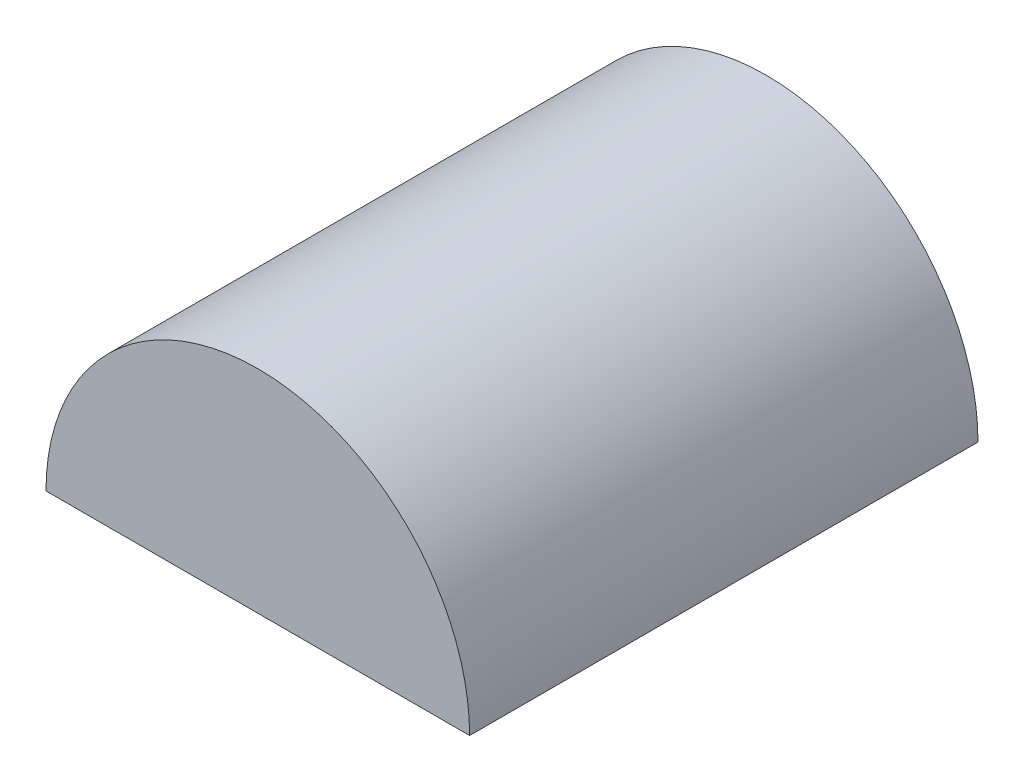
ISO-10303-21;
HEADER;
FILE_DESCRIPTION(('STEP AP214'),'2;1');
FILE_NAME('part.step','',(''),(''),'','','');
FILE_SCHEMA(('AUTOMOTIVE_DESIGN { 1 0 10303 214 1 1 1 1 }'));
ENDSEC;
DATA;
#1=APPLICATION_CONTEXT('core data for automotive mechanical design processes');
#2=APPLICATION_PROTOCOL_DEFINITION('international standard','automotive_design',2000,#1);
#3=PRODUCT_CONTEXT('',#1,'mechanical');
#4=PRODUCT('Part','Part','',(#3));
#5=PRODUCT_RELATED_PRODUCT_CATEGORY('part','',(#4));
#6=PRODUCT_DEFINITION_FORMATION('','',#4);
#7=PRODUCT_DEFINITION_CONTEXT('part definition',#1,'design');
#8=PRODUCT_DEFINITION('design','',#6,#7);
#9=PRODUCT_DEFINITION_SHAPE('','',#8);
#10=(LENGTH_UNIT() NAMED_UNIT(*) SI_UNIT(.MILLI.,.METRE.));
#11=(NAMED_UNIT(*) PLANE_ANGLE_UNIT() SI_UNIT($,.RADIAN.));
#12=(NAMED_UNIT(*) SI_UNIT($,.STERADIAN.) SOLID_ANGLE_UNIT());
#13=UNCERTAINTY_MEASURE_WITH_UNIT(LENGTH_MEASURE(1.E-05),#10,'distance_accuracy_value','');
#14=(GEOMETRIC_REPRESENTATION_CONTEXT(3) GLOBAL_UNCERTAINTY_ASSIGNED_CONTEXT((#13)) GLOBAL_UNIT_ASSIGNED_CONTEXT((#10,
#11,#12)) REPRESENTATION_CONTEXT('',''));
#15=CARTESIAN_POINT('',(0.,0.,0.));
#16=DIRECTION('',(0.,0.,1.));
#17=DIRECTION('',(1.,0.,0.));
#18=AXIS2_PLACEMENT_3D('',#15,#16,#17);
#19=CARTESIAN_POINT('',(0.,0.,0.6));
#20=DIRECTION('',(0.,0.,-1.));
#21=DIRECTION('',(-1.,0.,0.));
#22=AXIS2_PLACEMENT_3D('',#19,#20,#21);
#23=CYLINDRICAL_SURFACE('',#22,0.25);
#24=CARTESIAN_POINT('',(0.,0.,0.));
#25=DIRECTION('',(0.,0.,1.));
#26=DIRECTION('',(-1.,0.,0.));
#27=AXIS2_PLACEMENT_3D('',#24,#25,#26);
#28=CIRCLE('',#27,0.25);
#29=CARTESIAN_POINT('',(0.25,0.,0.));
#30=VERTEX_POINT('',#29);
#31=CARTESIAN_POINT('',(-0.25,0.,0.));
#32=VERTEX_POINT('',#31);
#33=EDGE_CURVE('E63',#30,#32,#28,.T.);
#34=ORIENTED_EDGE('',*,*,#33,.T.);
#35=DIRECTION('',(0.,0.,-1.));
#36=VECTOR('',#35,1.);
#37=CARTESIAN_POINT('',(-0.25,0.,0.6));
#38=LINE('',#37,#36);
#39=CARTESIAN_POINT('',(-0.25,0.,0.6));
#40=VERTEX_POINT('',#39);
#41=EDGE_CURVE('E43',#40,#32,#38,.T.);
#42=ORIENTED_EDGE('',*,*,#41,.F.);
#43=CARTESIAN_POINT('',(0.,0.,0.6));
#44=DIRECTION('',(0.,0.,1.));
#45=DIRECTION('',(-1.,0.,0.));
#46=AXIS2_PLACEMENT_3D('',#43,#44,#45);
#47=CIRCLE('',#46,0.25);
#48=CARTESIAN_POINT('',(0.25,0.,0.6));
#49=VERTEX_POINT('',#48);
#50=EDGE_CURVE('E67',#49,#40,#47,.T.);
#51=ORIENTED_EDGE('',*,*,#50,.F.);
#52=DIRECTION('',(0.,0.,-1.));
#53=VECTOR('',#52,1.);
#54=CARTESIAN_POINT('',(0.25,0.,0.6));
#55=LINE('',#54,#53);
#56=EDGE_CURVE('E11',#49,#30,#55,.T.);
#57=ORIENTED_EDGE('',*,*,#56,.T.);
#58=EDGE_LOOP('',(#34,#42,#51,#57));
#59=FACE_BOUND('',#58,.T.);
#60=ADVANCED_FACE('F35',(#59),#23,.T.);
#61=CARTESIAN_POINT('',(0.,0.,0.6));
#62=DIRECTION('',(0.,1.,0.));
#63=DIRECTION('',(0.,0.,1.));
#64=AXIS2_PLACEMENT_3D('',#61,#62,#63);
#65=PLANE('',#64);
#66=DIRECTION('',(1.,0.,0.));
#67=VECTOR('',#66,1.);
#68=CARTESIAN_POINT('',(0.,0.,0.));
#69=LINE('',#68,#67);
#70=EDGE_CURVE('E58',#32,#30,#69,.T.);
#71=ORIENTED_EDGE('',*,*,#70,.T.);
#72=ORIENTED_EDGE('',*,*,#56,.F.);
#73=DIRECTION('',(1.,0.,0.));
#74=VECTOR('',#73,1.);
#75=CARTESIAN_POINT('',(0.,0.,0.6));
#76=LINE('',#75,#74);
#77=EDGE_CURVE('E51',#40,#49,#76,.T.);
#78=ORIENTED_EDGE('',*,*,#77,.F.);
#79=ORIENTED_EDGE('',*,*,#41,.T.);
#80=EDGE_LOOP('',(#71,#72,#78,#79));
#81=FACE_BOUND('',#80,.T.);
#82=ADVANCED_FACE('F66',(#81),#65,.F.);
#83=CARTESIAN_POINT('',(0.,0.,0.6));
#84=DIRECTION('',(0.,0.,-1.));
#85=DIRECTION('',(-1.,0.,0.));
#86=AXIS2_PLACEMENT_3D('',#83,#84,#85);
#87=PLANE('',#86);
#88=ORIENTED_EDGE('',*,*,#77,.T.);
#89=ORIENTED_EDGE('',*,*,#50,.T.);
#90=EDGE_LOOP('',(#88,#89));
#91=FACE_BOUND('',#90,.T.);
#92=ADVANCED_FACE('F73',(#91),#87,.F.);
#93=CARTESIAN_POINT('',(0.,0.,0.));
#94=DIRECTION('',(0.,0.,-1.));
#95=DIRECTION('',(-1.,0.,0.));
#96=AXIS2_PLACEMENT_3D('',#93,#94,#95);
#97=PLANE('',#96);
#98=ORIENTED_EDGE('',*,*,#33,.F.);
#99=ORIENTED_EDGE('',*,*,#70,.F.);
#100=EDGE_LOOP('',(#98,#99));
#101=FACE_BOUND('',#100,.T.);
#102=ADVANCED_FACE('F68',(#101),#97,.T.);
#103=CLOSED_SHELL('',(#60,#82,#92,#102));
#104=MANIFOLD_SOLID_BREP('B2',#103);
#105=ADVANCED_BREP_SHAPE_REPRESENTATION('',(#18,#104),#14);
#106=SHAPE_DEFINITION_REPRESENTATION(#9,#105);
ENDSEC;
END-ISO-10303-21;
